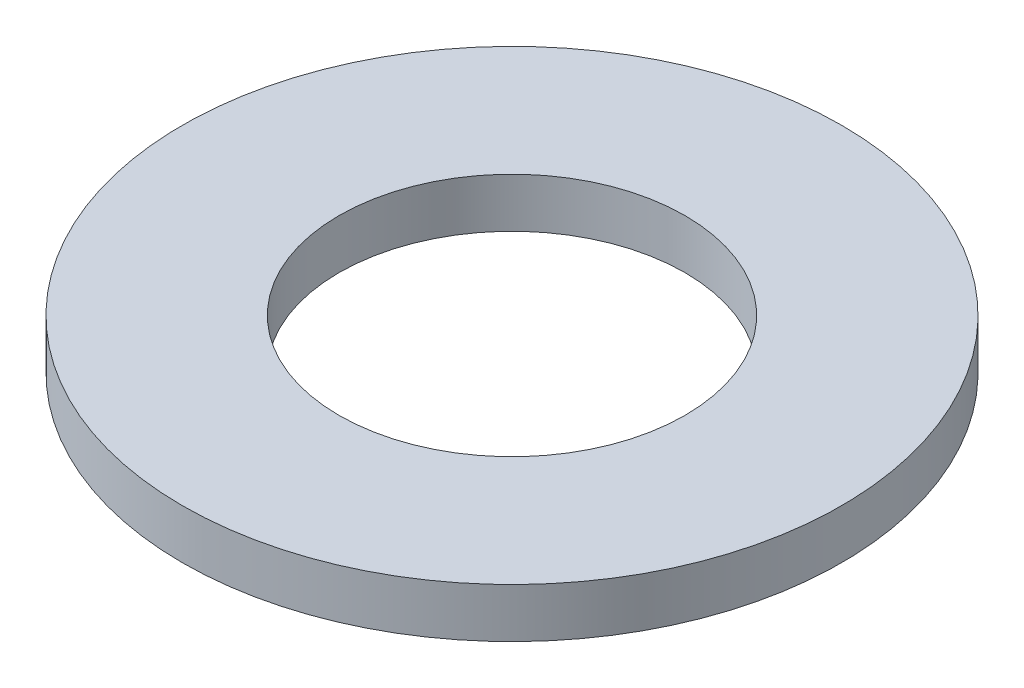
ISO-10303-21;
HEADER;
FILE_DESCRIPTION(('STEP AP214'),'2;1');
FILE_NAME('part.step','',(''),(''),'','','');
FILE_SCHEMA(('AUTOMOTIVE_DESIGN { 1 0 10303 214 1 1 1 1 }'));
ENDSEC;
DATA;
#1=APPLICATION_CONTEXT('core data for automotive mechanical design processes');
#2=APPLICATION_PROTOCOL_DEFINITION('international standard','automotive_design',2000,#1);
#3=PRODUCT_CONTEXT('',#1,'mechanical');
#4=PRODUCT('Part','Part','',(#3));
#5=PRODUCT_RELATED_PRODUCT_CATEGORY('part','',(#4));
#6=PRODUCT_DEFINITION_FORMATION('','',#4);
#7=PRODUCT_DEFINITION_CONTEXT('part definition',#1,'design');
#8=PRODUCT_DEFINITION('design','',#6,#7);
#9=PRODUCT_DEFINITION_SHAPE('','',#8);
#10=(LENGTH_UNIT() NAMED_UNIT(*) SI_UNIT(.MILLI.,.METRE.));
#11=(NAMED_UNIT(*) PLANE_ANGLE_UNIT() SI_UNIT($,.RADIAN.));
#12=(NAMED_UNIT(*) SI_UNIT($,.STERADIAN.) SOLID_ANGLE_UNIT());
#13=UNCERTAINTY_MEASURE_WITH_UNIT(LENGTH_MEASURE(1.E-05),#10,'distance_accuracy_value','');
#14=(GEOMETRIC_REPRESENTATION_CONTEXT(3) GLOBAL_UNCERTAINTY_ASSIGNED_CONTEXT((#13)) GLOBAL_UNIT_ASSIGNED_CONTEXT((#10,
#11,#12)) REPRESENTATION_CONTEXT('',''));
#15=CARTESIAN_POINT('',(0.,0.,0.));
#16=DIRECTION('',(0.,0.,1.));
#17=DIRECTION('',(1.,0.,0.));
#18=AXIS2_PLACEMENT_3D('',#15,#16,#17);
#19=CARTESIAN_POINT('',(0.,0.6,0.));
#20=DIRECTION('',(0.,1.,0.));
#21=DIRECTION('',(0.,0.,1.));
#22=AXIS2_PLACEMENT_3D('',#19,#20,#21);
#23=PLANE('',#22);
#24=CARTESIAN_POINT('',(0.,0.6,0.));
#25=DIRECTION('',(0.,1.,0.));
#26=DIRECTION('',(0.,0.,1.));
#27=AXIS2_PLACEMENT_3D('',#24,#25,#26);
#28=CIRCLE('',#27,4.);
#29=CARTESIAN_POINT('',(0.,0.6,4.));
#30=VERTEX_POINT('',#29);
#31=EDGE_CURVE('E10',#30,#30,#28,.T.);
#32=ORIENTED_EDGE('',*,*,#31,.T.);
#33=EDGE_LOOP('',(#32));
#34=FACE_BOUND('',#33,.T.);
#35=CARTESIAN_POINT('',(0.,0.6,0.));
#36=DIRECTION('',(0.,1.,0.));
#37=DIRECTION('',(0.,0.,1.));
#38=AXIS2_PLACEMENT_3D('',#35,#36,#37);
#39=CIRCLE('',#38,2.1);
#40=CARTESIAN_POINT('',(0.,0.6,2.1));
#41=VERTEX_POINT('',#40);
#42=EDGE_CURVE('E46',#41,#41,#39,.T.);
#43=ORIENTED_EDGE('',*,*,#42,.F.);
#44=EDGE_LOOP('',(#43));
#45=FACE_BOUND('',#44,.T.);
#46=ADVANCED_FACE('F35',(#34,#45),#23,.T.);
#47=CARTESIAN_POINT('',(0.,0.,0.));
#48=DIRECTION('',(0.,1.,0.));
#49=DIRECTION('',(0.,0.,1.));
#50=AXIS2_PLACEMENT_3D('',#47,#48,#49);
#51=PLANE('',#50);
#52=CARTESIAN_POINT('',(0.,0.,0.));
#53=DIRECTION('',(0.,1.,0.));
#54=DIRECTION('',(0.,0.,1.));
#55=AXIS2_PLACEMENT_3D('',#52,#53,#54);
#56=CIRCLE('',#55,4.);
#57=CARTESIAN_POINT('',(0.,0.,4.));
#58=VERTEX_POINT('',#57);
#59=EDGE_CURVE('E39',#58,#58,#56,.T.);
#60=ORIENTED_EDGE('',*,*,#59,.F.);
#61=EDGE_LOOP('',(#60));
#62=FACE_BOUND('',#61,.T.);
#63=CARTESIAN_POINT('',(0.,0.,0.));
#64=DIRECTION('',(0.,1.,0.));
#65=DIRECTION('',(0.,0.,1.));
#66=AXIS2_PLACEMENT_3D('',#63,#64,#65);
#67=CIRCLE('',#66,2.1);
#68=CARTESIAN_POINT('',(0.,0.,2.1));
#69=VERTEX_POINT('',#68);
#70=EDGE_CURVE('E48',#69,#69,#67,.T.);
#71=ORIENTED_EDGE('',*,*,#70,.T.);
#72=EDGE_LOOP('',(#71));
#73=FACE_BOUND('',#72,.T.);
#74=ADVANCED_FACE('F58',(#62,#73),#51,.F.);
#75=CARTESIAN_POINT('',(0.,0.6,0.));
#76=DIRECTION('',(0.,-1.,0.));
#77=DIRECTION('',(0.,0.,-1.));
#78=AXIS2_PLACEMENT_3D('',#75,#76,#77);
#79=CYLINDRICAL_SURFACE('',#78,4.);
#80=ORIENTED_EDGE('',*,*,#31,.F.);
#81=EDGE_LOOP('',(#80));
#82=FACE_BOUND('',#81,.T.);
#83=ORIENTED_EDGE('',*,*,#59,.T.);
#84=EDGE_LOOP('',(#83));
#85=FACE_BOUND('',#84,.T.);
#86=ADVANCED_FACE('F37',(#82,#85),#79,.T.);
#87=CARTESIAN_POINT('',(0.,0.6,0.));
#88=DIRECTION('',(0.,-1.,0.));
#89=DIRECTION('',(0.,0.,-1.));
#90=AXIS2_PLACEMENT_3D('',#87,#88,#89);
#91=CYLINDRICAL_SURFACE('',#90,2.1);
#92=ORIENTED_EDGE('',*,*,#42,.T.);
#93=EDGE_LOOP('',(#92));
#94=FACE_BOUND('',#93,.T.);
#95=ORIENTED_EDGE('',*,*,#70,.F.);
#96=EDGE_LOOP('',(#95));
#97=FACE_BOUND('',#96,.T.);
#98=ADVANCED_FACE('F54',(#94,#97),#91,.F.);
#99=CLOSED_SHELL('',(#46,#74,#86,#98));
#100=MANIFOLD_SOLID_BREP('B2',#99);
#101=ADVANCED_BREP_SHAPE_REPRESENTATION('',(#18,#100),#14);
#102=SHAPE_DEFINITION_REPRESENTATION(#9,#101);
ENDSEC;
END-ISO-10303-21;
